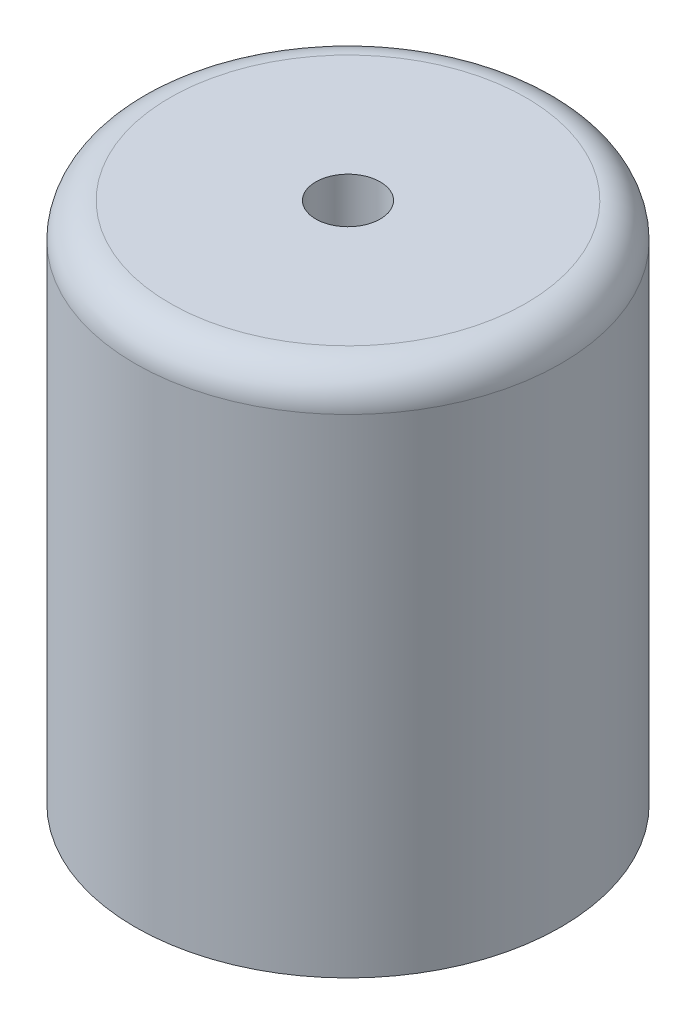
ISO-10303-21;
HEADER;
FILE_DESCRIPTION(('STEP AP214'),'2;1');
FILE_NAME('part.step','',(''),(''),'','','');
FILE_SCHEMA(('AUTOMOTIVE_DESIGN { 1 0 10303 214 1 1 1 1 }'));
ENDSEC;
DATA;
#1=APPLICATION_CONTEXT('core data for automotive mechanical design processes');
#2=APPLICATION_PROTOCOL_DEFINITION('international standard','automotive_design',2000,#1);
#3=PRODUCT_CONTEXT('',#1,'mechanical');
#4=PRODUCT('Part','Part','',(#3));
#5=PRODUCT_RELATED_PRODUCT_CATEGORY('part','',(#4));
#6=PRODUCT_DEFINITION_FORMATION('','',#4);
#7=PRODUCT_DEFINITION_CONTEXT('part definition',#1,'design');
#8=PRODUCT_DEFINITION('design','',#6,#7);
#9=PRODUCT_DEFINITION_SHAPE('','',#8);
#10=(LENGTH_UNIT() NAMED_UNIT(*) SI_UNIT(.MILLI.,.METRE.));
#11=(NAMED_UNIT(*) PLANE_ANGLE_UNIT() SI_UNIT($,.RADIAN.));
#12=(NAMED_UNIT(*) SI_UNIT($,.STERADIAN.) SOLID_ANGLE_UNIT());
#13=UNCERTAINTY_MEASURE_WITH_UNIT(LENGTH_MEASURE(1.E-05),#10,'distance_accuracy_value','');
#14=(GEOMETRIC_REPRESENTATION_CONTEXT(3) GLOBAL_UNCERTAINTY_ASSIGNED_CONTEXT((#13)) GLOBAL_UNIT_ASSIGNED_CONTEXT((#10,
#11,#12)) REPRESENTATION_CONTEXT('',''));
#15=CARTESIAN_POINT('',(0.,0.,0.));
#16=DIRECTION('',(0.,0.,1.));
#17=DIRECTION('',(1.,0.,0.));
#18=AXIS2_PLACEMENT_3D('',#15,#16,#17);
#19=CARTESIAN_POINT('',(0.,-45.339,0.));
#20=DIRECTION('',(0.,-1.,0.));
#21=DIRECTION('',(1.,0.,0.));
#22=AXIS2_PLACEMENT_3D('',#19,#20,#21);
#23=CYLINDRICAL_SURFACE('',#22,10.875012636);
#24=CARTESIAN_POINT('',(0.,-45.339,0.));
#25=DIRECTION('',(0.,-1.,0.));
#26=DIRECTION('',(1.,0.,0.));
#27=AXIS2_PLACEMENT_3D('',#24,#25,#26);
#28=CIRCLE('',#27,10.875012636);
#29=CARTESIAN_POINT('',(10.875012636,-45.339,0.));
#30=VERTEX_POINT('',#29);
#31=EDGE_CURVE('E77',#30,#30,#28,.T.);
#32=ORIENTED_EDGE('',*,*,#31,.F.);
#33=EDGE_LOOP('',(#32));
#34=FACE_BOUND('',#33,.T.);
#35=CARTESIAN_POINT('',(0.,-53.213,0.));
#36=DIRECTION('',(0.,-1.,0.));
#37=DIRECTION('',(1.,0.,0.));
#38=AXIS2_PLACEMENT_3D('',#35,#36,#37);
#39=CIRCLE('',#38,10.875012636);
#40=CARTESIAN_POINT('',(10.875012636,-53.213,0.));
#41=VERTEX_POINT('',#40);
#42=EDGE_CURVE('E78',#41,#41,#39,.F.);
#43=ORIENTED_EDGE('',*,*,#42,.F.);
#44=EDGE_LOOP('',(#43));
#45=FACE_BOUND('',#44,.T.);
#46=ADVANCED_FACE('F48',(#34,#45),#23,.F.);
#47=CARTESIAN_POINT('',(0.,-37.465,0.));
#48=DIRECTION('',(0.,-1.,0.));
#49=DIRECTION('',(1.,0.,0.));
#50=AXIS2_PLACEMENT_3D('',#47,#48,#49);
#51=CYLINDRICAL_SURFACE('',#50,10.825000036);
#52=CARTESIAN_POINT('',(0.,-37.465,0.));
#53=DIRECTION('',(0.,-1.,0.));
#54=DIRECTION('',(1.,0.,0.));
#55=AXIS2_PLACEMENT_3D('',#52,#53,#54);
#56=CIRCLE('',#55,10.825000036);
#57=CARTESIAN_POINT('',(10.825000036,-37.465,0.));
#58=VERTEX_POINT('',#57);
#59=EDGE_CURVE('E73',#58,#58,#56,.T.);
#60=ORIENTED_EDGE('',*,*,#59,.F.);
#61=EDGE_LOOP('',(#60));
#62=FACE_BOUND('',#61,.T.);
#63=CARTESIAN_POINT('',(0.,-45.339,0.));
#64=DIRECTION('',(0.,-1.,0.));
#65=DIRECTION('',(1.,0.,0.));
#66=AXIS2_PLACEMENT_3D('',#63,#64,#65);
#67=CIRCLE('',#66,10.825000036);
#68=CARTESIAN_POINT('',(10.825000036,-45.339,0.));
#69=VERTEX_POINT('',#68);
#70=EDGE_CURVE('E75',#69,#69,#67,.F.);
#71=ORIENTED_EDGE('',*,*,#70,.F.);
#72=EDGE_LOOP('',(#71));
#73=FACE_BOUND('',#72,.T.);
#74=ADVANCED_FACE('F127',(#62,#73),#51,.F.);
#75=CARTESIAN_POINT('',(0.,-69.215,0.));
#76=DIRECTION('',(0.,1.,0.));
#77=DIRECTION('',(-1.,0.,0.));
#78=AXIS2_PLACEMENT_3D('',#75,#76,#77);
#79=CYLINDRICAL_SURFACE('',#78,15.5194905522969);
#80=CARTESIAN_POINT('',(0.,-33.655,0.));
#81=DIRECTION('',(0.,-1.,0.));
#82=DIRECTION('',(1.,0.,0.));
#83=AXIS2_PLACEMENT_3D('',#80,#81,#82);
#84=CIRCLE('',#83,15.5194905522969);
#85=CARTESIAN_POINT('',(-15.5194905522969,-33.655,0.));
#86=VERTEX_POINT('',#85);
#87=EDGE_CURVE('E57',#86,#86,#84,.T.);
#88=CARTESIAN_POINT('',(0.,-69.215,0.));
#89=DIRECTION('',(0.,-1.,0.));
#90=DIRECTION('',(1.,0.,0.));
#91=AXIS2_PLACEMENT_3D('',#88,#89,#90);
#92=CIRCLE('',#91,15.5194905522969);
#93=CARTESIAN_POINT('',(-15.5194905522969,-69.215,0.));
#94=VERTEX_POINT('',#93);
#95=EDGE_CURVE('E102',#94,#94,#92,.T.);
#96=CARTESIAN_POINT('',(-15.5194905522969,-33.655,0.));
#97=CARTESIAN_POINT('',(-15.5194905522969,-34.0254166666667,0.));
#98=CARTESIAN_POINT('',(-15.5194905522969,-34.3958333333333,0.));
#99=CARTESIAN_POINT('',(-15.5194905522969,-35.1366666666667,0.));
#100=CARTESIAN_POINT('',(-15.5194905522969,-35.5070833333333,0.));
#101=CARTESIAN_POINT('',(-15.5194905522969,-36.2479166666667,0.));
#102=CARTESIAN_POINT('',(-15.5194905522969,-36.6183333333333,0.));
#103=CARTESIAN_POINT('',(-15.5194905522969,-37.3591666666667,0.));
#104=CARTESIAN_POINT('',(-15.5194905522969,-37.7295833333333,0.));
#105=CARTESIAN_POINT('',(-15.5194905522969,-38.4704166666667,0.));
#106=CARTESIAN_POINT('',(-15.5194905522969,-38.8408333333333,0.));
#107=CARTESIAN_POINT('',(-15.5194905522969,-39.5816666666667,0.));
#108=CARTESIAN_POINT('',(-15.5194905522969,-39.9520833333333,0.));
#109=CARTESIAN_POINT('',(-15.5194905522969,-40.6929166666667,0.));
#110=CARTESIAN_POINT('',(-15.5194905522969,-41.0633333333333,0.));
#111=CARTESIAN_POINT('',(-15.5194905522969,-41.8041666666667,0.));
#112=CARTESIAN_POINT('',(-15.5194905522969,-42.1745833333333,0.));
#113=CARTESIAN_POINT('',(-15.5194905522969,-42.9154166666667,0.));
#114=CARTESIAN_POINT('',(-15.5194905522969,-43.2858333333333,0.));
#115=CARTESIAN_POINT('',(-15.5194905522969,-44.0266666666667,0.));
#116=CARTESIAN_POINT('',(-15.5194905522969,-44.3970833333333,0.));
#117=CARTESIAN_POINT('',(-15.5194905522969,-45.1379166666667,0.));
#118=CARTESIAN_POINT('',(-15.5194905522969,-45.5083333333333,0.));
#119=CARTESIAN_POINT('',(-15.5194905522969,-46.2491666666667,0.));
#120=CARTESIAN_POINT('',(-15.5194905522969,-46.6195833333333,0.));
#121=CARTESIAN_POINT('',(-15.5194905522969,-47.3604166666667,0.));
#122=CARTESIAN_POINT('',(-15.5194905522969,-47.7308333333333,0.));
#123=CARTESIAN_POINT('',(-15.5194905522969,-48.4716666666667,0.));
#124=CARTESIAN_POINT('',(-15.5194905522969,-48.8420833333333,0.));
#125=CARTESIAN_POINT('',(-15.5194905522969,-49.5829166666667,0.));
#126=CARTESIAN_POINT('',(-15.5194905522969,-49.9533333333333,0.));
#127=CARTESIAN_POINT('',(-15.5194905522969,-50.6941666666667,0.));
#128=CARTESIAN_POINT('',(-15.5194905522969,-51.0645833333333,0.));
#129=CARTESIAN_POINT('',(-15.5194905522969,-51.8054166666667,0.));
#130=CARTESIAN_POINT('',(-15.5194905522969,-52.1758333333333,0.));
#131=CARTESIAN_POINT('',(-15.5194905522969,-52.9166666666667,0.));
#132=CARTESIAN_POINT('',(-15.5194905522969,-53.2870833333333,0.));
#133=CARTESIAN_POINT('',(-15.5194905522969,-54.0279166666667,0.));
#134=CARTESIAN_POINT('',(-15.5194905522969,-54.3983333333333,0.));
#135=CARTESIAN_POINT('',(-15.5194905522969,-55.1391666666667,0.));
#136=CARTESIAN_POINT('',(-15.5194905522969,-55.5095833333333,0.));
#137=CARTESIAN_POINT('',(-15.5194905522969,-56.2504166666667,0.));
#138=CARTESIAN_POINT('',(-15.5194905522969,-56.6208333333333,0.));
#139=CARTESIAN_POINT('',(-15.5194905522969,-57.3616666666667,0.));
#140=CARTESIAN_POINT('',(-15.5194905522969,-57.7320833333333,0.));
#141=CARTESIAN_POINT('',(-15.5194905522969,-58.4729166666667,0.));
#142=CARTESIAN_POINT('',(-15.5194905522969,-58.8433333333333,0.));
#143=CARTESIAN_POINT('',(-15.5194905522969,-59.5841666666667,0.));
#144=CARTESIAN_POINT('',(-15.5194905522969,-59.9545833333333,0.));
#145=CARTESIAN_POINT('',(-15.5194905522969,-60.6954166666667,0.));
#146=CARTESIAN_POINT('',(-15.5194905522969,-61.0658333333333,0.));
#147=CARTESIAN_POINT('',(-15.5194905522969,-61.8066666666667,0.));
#148=CARTESIAN_POINT('',(-15.5194905522969,-62.1770833333333,0.));
#149=CARTESIAN_POINT('',(-15.5194905522969,-62.9179166666667,0.));
#150=CARTESIAN_POINT('',(-15.5194905522969,-63.2883333333333,0.));
#151=CARTESIAN_POINT('',(-15.5194905522969,-64.0291666666667,0.));
#152=CARTESIAN_POINT('',(-15.5194905522969,-64.3995833333333,0.));
#153=CARTESIAN_POINT('',(-15.5194905522969,-65.1404166666667,0.));
#154=CARTESIAN_POINT('',(-15.5194905522969,-65.5108333333333,0.));
#155=CARTESIAN_POINT('',(-15.5194905522969,-66.2516666666667,0.));
#156=CARTESIAN_POINT('',(-15.5194905522969,-66.6220833333334,0.));
#157=CARTESIAN_POINT('',(-15.5194905522969,-67.3629166666667,0.));
#158=CARTESIAN_POINT('',(-15.5194905522969,-67.7333333333333,0.));
#159=CARTESIAN_POINT('',(-15.5194905522969,-68.4741666666667,0.));
#160=CARTESIAN_POINT('',(-15.5194905522969,-68.8445833333333,0.));
#161=CARTESIAN_POINT('',(-15.5194905522969,-69.215,0.));
#162=B_SPLINE_CURVE_WITH_KNOTS('',3,(#96,#97,#98,#99,#100,#101,#102,#103,#104,#105,#106,#107,
#108,#109,#110,#111,#112,#113,#114,#115,#116,#117,#118,#119,#120,#121,#122,#123,#124,#125,#126,
#127,#128,#129,#130,#131,#132,#133,#134,#135,#136,#137,#138,#139,#140,#141,#142,#143,#144,#145,
#146,#147,#148,#149,#150,#151,#152,#153,#154,#155,#156,#157,#158,#159,#160,#161),.UNSPECIFIED.,
.F.,.F.,(4,2,2,2,2,2,2,2,2,2,2,2,2,2,2,2,2,2,2,2,2,2,2,2,2,2,2,2,2,2,2,2,4),(0.,1.11125,2.2225,
3.33375,4.445,5.55624999999999,6.6675,7.77874999999999,8.89,10.00125,11.1125,12.22375,13.335,
14.44625,15.5575,16.66875,17.78,18.89125,20.0025,21.11375,22.225,23.33625,24.4475,25.55875,
26.67,27.78125,28.8925,30.00375,31.115,32.22625,33.3375,34.44875,35.56),.UNSPECIFIED.);
#163=EDGE_CURVE('BSEAM133',#86,#94,#162,.T.);
#164=ORIENTED_EDGE('',*,*,#87,.T.);
#165=ORIENTED_EDGE('',*,*,#95,.F.);
#166=ORIENTED_EDGE('',*,*,#163,.T.);
#167=ORIENTED_EDGE('',*,*,#163,.F.);
#168=EDGE_LOOP('',(#164,#166,#165,#167));
#169=FACE_BOUND('',#168,.T.);
#170=ADVANCED_FACE('F133',(#169),#79,.T.);
#171=CARTESIAN_POINT('',(0.,-69.215,0.));
#172=DIRECTION('',(0.,-1.,0.));
#173=DIRECTION('',(1.,0.,0.));
#174=AXIS2_PLACEMENT_3D('',#171,#172,#173);
#175=PLANE('',#174);
#176=CARTESIAN_POINT('',(0.,-69.215,0.));
#177=DIRECTION('',(0.,-1.,0.));
#178=DIRECTION('',(1.,0.,0.));
#179=AXIS2_PLACEMENT_3D('',#176,#177,#178);
#180=CIRCLE('',#179,11.333000036);
#181=CARTESIAN_POINT('',(11.333000036,-69.215,0.));
#182=VERTEX_POINT('',#181);
#183=EDGE_CURVE('E65',#182,#182,#180,.F.);
#184=ORIENTED_EDGE('',*,*,#183,.T.);
#185=EDGE_LOOP('',(#184));
#186=FACE_BOUND('',#185,.T.);
#187=ORIENTED_EDGE('',*,*,#95,.T.);
#188=EDGE_LOOP('',(#187));
#189=FACE_BOUND('',#188,.T.);
#190=ADVANCED_FACE('F107',(#186,#189),#175,.T.);
#191=CARTESIAN_POINT('',(0.,-31.115,0.));
#192=DIRECTION('',(0.,-1.,0.));
#193=DIRECTION('',(1.,0.,0.));
#194=AXIS2_PLACEMENT_3D('',#191,#192,#193);
#195=PLANE('',#194);
#196=CARTESIAN_POINT('',(0.,-31.115,0.));
#197=DIRECTION('',(0.,1.,0.));
#198=DIRECTION('',(-1.,0.,0.));
#199=AXIS2_PLACEMENT_3D('',#196,#197,#198);
#200=CIRCLE('',#199,2.3495);
#201=CARTESIAN_POINT('',(-2.3495,-31.115,0.));
#202=VERTEX_POINT('',#201);
#203=EDGE_CURVE('E74',#202,#202,#200,.T.);
#204=ORIENTED_EDGE('',*,*,#203,.F.);
#205=EDGE_LOOP('',(#204));
#206=FACE_BOUND('',#205,.T.);
#207=CARTESIAN_POINT('',(0.,-31.115,0.));
#208=DIRECTION('',(0.,-1.,0.));
#209=DIRECTION('',(1.,0.,0.));
#210=AXIS2_PLACEMENT_3D('',#207,#208,#209);
#211=CIRCLE('',#210,12.9794905522969);
#212=CARTESIAN_POINT('',(12.9794905522969,-31.115,0.));
#213=VERTEX_POINT('',#212);
#214=EDGE_CURVE('E10',#213,#213,#211,.F.);
#215=ORIENTED_EDGE('',*,*,#214,.T.);
#216=EDGE_LOOP('',(#215));
#217=FACE_BOUND('',#216,.T.);
#218=ADVANCED_FACE('F120',(#206,#217),#195,.F.);
#219=CARTESIAN_POINT('',(0.,-37.465,0.));
#220=DIRECTION('',(0.,-1.,0.));
#221=DIRECTION('',(1.,0.,0.));
#222=AXIS2_PLACEMENT_3D('',#219,#220,#221);
#223=PLANE('',#222);
#224=CARTESIAN_POINT('',(0.,-37.465,0.));
#225=DIRECTION('',(0.,-1.,0.));
#226=DIRECTION('',(1.,0.,0.));
#227=AXIS2_PLACEMENT_3D('',#224,#225,#226);
#228=CIRCLE('',#227,2.3495);
#229=CARTESIAN_POINT('',(2.3495,-37.465,0.));
#230=VERTEX_POINT('',#229);
#231=EDGE_CURVE('E69',#230,#230,#228,.T.);
#232=ORIENTED_EDGE('',*,*,#231,.F.);
#233=EDGE_LOOP('',(#232));
#234=FACE_BOUND('',#233,.T.);
#235=ORIENTED_EDGE('',*,*,#59,.T.);
#236=EDGE_LOOP('',(#235));
#237=FACE_BOUND('',#236,.T.);
#238=ADVANCED_FACE('F112',(#234,#237),#223,.T.);
#239=CARTESIAN_POINT('',(0.,-68.707,0.));
#240=DIRECTION('',(0.,-1.,0.));
#241=DIRECTION('',(1.,0.,0.));
#242=AXIS2_PLACEMENT_3D('',#239,#240,#241);
#243=CONICAL_SURFACE('',#242,10.825000036,0.785398163397457);
#244=CARTESIAN_POINT('',(0.,-68.8070126,0.));
#245=DIRECTION('',(0.,-1.,0.));
#246=DIRECTION('',(1.,0.,0.));
#247=AXIS2_PLACEMENT_3D('',#244,#245,#246);
#248=CIRCLE('',#247,10.925012636);
#249=CARTESIAN_POINT('',(10.925012636,-68.8070126,0.));
#250=VERTEX_POINT('',#249);
#251=EDGE_CURVE('E52',#250,#250,#248,.T.);
#252=ORIENTED_EDGE('',*,*,#251,.F.);
#253=EDGE_LOOP('',(#252));
#254=FACE_BOUND('',#253,.T.);
#255=ORIENTED_EDGE('',*,*,#183,.F.);
#256=EDGE_LOOP('',(#255));
#257=FACE_BOUND('',#256,.T.);
#258=ADVANCED_FACE('F110',(#254,#257),#243,.F.);
#259=CARTESIAN_POINT('',(0.,-33.655,0.));
#260=DIRECTION('',(0.,-1.,0.));
#261=DIRECTION('',(1.,0.,0.));
#262=AXIS2_PLACEMENT_3D('',#259,#260,#261);
#263=TOROIDAL_SURFACE('',#262,12.9794905522969,2.54);
#264=ORIENTED_EDGE('',*,*,#214,.F.);
#265=EDGE_LOOP('',(#264));
#266=FACE_BOUND('',#265,.T.);
#267=ORIENTED_EDGE('',*,*,#87,.F.);
#268=EDGE_LOOP('',(#267));
#269=FACE_BOUND('',#268,.T.);
#270=ADVANCED_FACE('F50',(#266,#269),#263,.T.);
#271=CARTESIAN_POINT('',(0.,-69.215,0.));
#272=DIRECTION('',(0.,1.,0.));
#273=DIRECTION('',(-1.,0.,0.));
#274=AXIS2_PLACEMENT_3D('',#271,#272,#273);
#275=CYLINDRICAL_SURFACE('',#274,2.3495);
#276=ORIENTED_EDGE('',*,*,#231,.T.);
#277=EDGE_LOOP('',(#276));
#278=FACE_BOUND('',#277,.T.);
#279=ORIENTED_EDGE('',*,*,#203,.T.);
#280=EDGE_LOOP('',(#279));
#281=FACE_BOUND('',#280,.T.);
#282=ADVANCED_FACE('F118',(#278,#281),#275,.F.);
#283=CARTESIAN_POINT('',(0.,-45.339,0.));
#284=DIRECTION('',(0.,-1.,0.));
#285=DIRECTION('',(1.,0.,0.));
#286=AXIS2_PLACEMENT_3D('',#283,#284,#285);
#287=PLANE('',#286);
#288=ORIENTED_EDGE('',*,*,#31,.T.);
#289=EDGE_LOOP('',(#288));
#290=FACE_BOUND('',#289,.T.);
#291=ORIENTED_EDGE('',*,*,#70,.T.);
#292=EDGE_LOOP('',(#291));
#293=FACE_BOUND('',#292,.T.);
#294=ADVANCED_FACE('F140',(#290,#293),#287,.T.);
#295=CARTESIAN_POINT('',(0.,-53.213,0.));
#296=DIRECTION('',(0.,-1.,0.));
#297=DIRECTION('',(1.,0.,0.));
#298=AXIS2_PLACEMENT_3D('',#295,#296,#297);
#299=PLANE('',#298);
#300=CARTESIAN_POINT('',(0.,-53.213,0.));
#301=DIRECTION('',(0.,-1.,0.));
#302=DIRECTION('',(1.,0.,0.));
#303=AXIS2_PLACEMENT_3D('',#300,#301,#302);
#304=CIRCLE('',#303,10.925012636);
#305=CARTESIAN_POINT('',(10.925012636,-53.213,0.));
#306=VERTEX_POINT('',#305);
#307=EDGE_CURVE('E81',#306,#306,#304,.T.);
#308=ORIENTED_EDGE('',*,*,#307,.T.);
#309=EDGE_LOOP('',(#308));
#310=FACE_BOUND('',#309,.T.);
#311=ORIENTED_EDGE('',*,*,#42,.T.);
#312=EDGE_LOOP('',(#311));
#313=FACE_BOUND('',#312,.T.);
#314=ADVANCED_FACE('F191',(#310,#313),#299,.T.);
#315=CARTESIAN_POINT('',(0.,-53.213,0.));
#316=DIRECTION('',(0.,-1.,0.));
#317=DIRECTION('',(1.,0.,0.));
#318=AXIS2_PLACEMENT_3D('',#315,#316,#317);
#319=CYLINDRICAL_SURFACE('',#318,10.925012636);
#320=ORIENTED_EDGE('',*,*,#251,.T.);
#321=EDGE_LOOP('',(#320));
#322=FACE_BOUND('',#321,.T.);
#323=ORIENTED_EDGE('',*,*,#307,.F.);
#324=EDGE_LOOP('',(#323));
#325=FACE_BOUND('',#324,.T.);
#326=ADVANCED_FACE('F198',(#322,#325),#319,.F.);
#327=CLOSED_SHELL('',(#46,#74,#170,#190,#218,#238,#258,#270,#282,#294,#314,#326));
#328=MANIFOLD_SOLID_BREP('B2',#327);
#329=ADVANCED_BREP_SHAPE_REPRESENTATION('',(#18,#328),#14);
#330=SHAPE_DEFINITION_REPRESENTATION(#9,#329);
ENDSEC;
END-ISO-10303-21;
